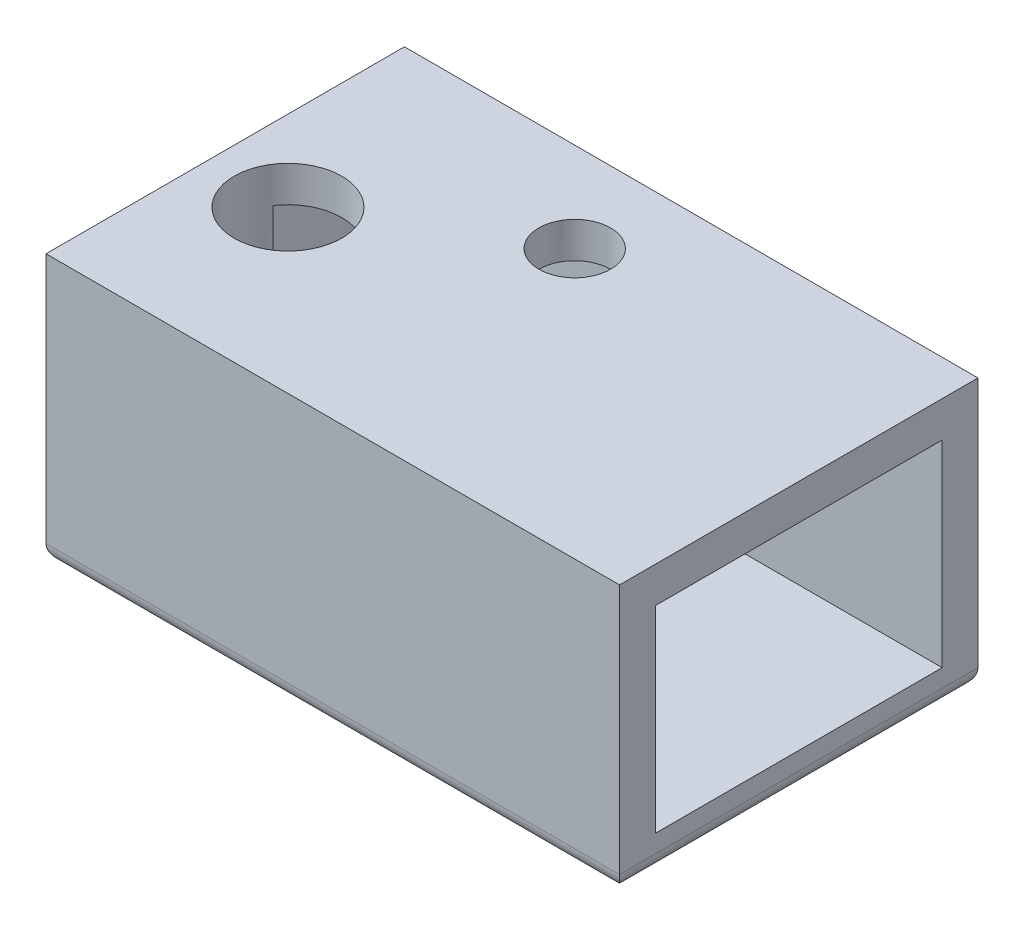
ISO-10303-21;
HEADER;
FILE_DESCRIPTION(('STEP AP214'),'2;1');
FILE_NAME('part.step','',(''),(''),'','','');
FILE_SCHEMA(('AUTOMOTIVE_DESIGN { 1 0 10303 214 1 1 1 1 }'));
ENDSEC;
DATA;
#1=APPLICATION_CONTEXT('core data for automotive mechanical design processes');
#2=APPLICATION_PROTOCOL_DEFINITION('international standard','automotive_design',2000,#1);
#3=PRODUCT_CONTEXT('',#1,'mechanical');
#4=PRODUCT('Part','Part','',(#3));
#5=PRODUCT_RELATED_PRODUCT_CATEGORY('part','',(#4));
#6=PRODUCT_DEFINITION_FORMATION('','',#4);
#7=PRODUCT_DEFINITION_CONTEXT('part definition',#1,'design');
#8=PRODUCT_DEFINITION('design','',#6,#7);
#9=PRODUCT_DEFINITION_SHAPE('','',#8);
#10=(LENGTH_UNIT() NAMED_UNIT(*) SI_UNIT(.MILLI.,.METRE.));
#11=(NAMED_UNIT(*) PLANE_ANGLE_UNIT() SI_UNIT($,.RADIAN.));
#12=(NAMED_UNIT(*) SI_UNIT($,.STERADIAN.) SOLID_ANGLE_UNIT());
#13=UNCERTAINTY_MEASURE_WITH_UNIT(LENGTH_MEASURE(1.E-05),#10,'distance_accuracy_value','');
#14=(GEOMETRIC_REPRESENTATION_CONTEXT(3) GLOBAL_UNCERTAINTY_ASSIGNED_CONTEXT((#13)) GLOBAL_UNIT_ASSIGNED_CONTEXT((#10,
#11,#12)) REPRESENTATION_CONTEXT('',''));
#15=CARTESIAN_POINT('',(0.,0.,0.));
#16=DIRECTION('',(0.,0.,1.));
#17=DIRECTION('',(1.,0.,0.));
#18=AXIS2_PLACEMENT_3D('',#15,#16,#17);
#19=CARTESIAN_POINT('',(-15.,11.,8.));
#20=DIRECTION('',(1.,0.,0.));
#21=DIRECTION('',(0.,0.,-1.));
#22=AXIS2_PLACEMENT_3D('',#19,#20,#21);
#23=PLANE('',#22);
#24=DIRECTION('',(0.,1.,0.));
#25=VECTOR('',#24,1.);
#26=CARTESIAN_POINT('',(-15.,-8.48528137423857,-0.658312395177701));
#27=LINE('',#26,#25);
#28=CARTESIAN_POINT('',(-15.,0.,-0.658312395177701));
#29=VERTEX_POINT('',#28);
#30=CARTESIAN_POINT('',(-15.,11.,-0.658312395177701));
#31=VERTEX_POINT('',#30);
#32=EDGE_CURVE('E129',#29,#31,#27,.T.);
#33=ORIENTED_EDGE('',*,*,#32,.F.);
#34=DIRECTION('',(0.,0.,1.));
#35=VECTOR('',#34,1.);
#36=CARTESIAN_POINT('',(-15.,0.,8.));
#37=LINE('',#36,#35);
#38=CARTESIAN_POINT('',(-15.,0.,-8.));
#39=VERTEX_POINT('',#38);
#40=EDGE_CURVE('E143',#39,#29,#37,.T.);
#41=ORIENTED_EDGE('',*,*,#40,.F.);
#42=DIRECTION('',(0.,-1.,0.));
#43=VECTOR('',#42,1.);
#44=CARTESIAN_POINT('',(-15.,11.,-8.));
#45=LINE('',#44,#43);
#46=CARTESIAN_POINT('',(-15.,11.,-8.));
#47=VERTEX_POINT('',#46);
#48=EDGE_CURVE('E167',#47,#39,#45,.T.);
#49=ORIENTED_EDGE('',*,*,#48,.F.);
#50=DIRECTION('',(0.,0.,1.));
#51=VECTOR('',#50,1.);
#52=CARTESIAN_POINT('',(-15.,11.,8.));
#53=LINE('',#52,#51);
#54=EDGE_CURVE('E145',#47,#31,#53,.T.);
#55=ORIENTED_EDGE('',*,*,#54,.T.);
#56=EDGE_LOOP('',(#33,#41,#49,#55));
#57=FACE_BOUND('',#56,.T.);
#58=ADVANCED_FACE('F35',(#57),#23,.T.);
#59=CARTESIAN_POINT('',(15.,11.,8.));
#60=DIRECTION('',(-1.,0.,0.));
#61=DIRECTION('',(0.,0.,1.));
#62=AXIS2_PLACEMENT_3D('',#59,#60,#61);
#63=PLANE('',#62);
#64=DIRECTION('',(0.,-1.,0.));
#65=VECTOR('',#64,1.);
#66=CARTESIAN_POINT('',(15.,11.,10.));
#67=LINE('',#66,#65);
#68=CARTESIAN_POINT('',(15.,13.,10.));
#69=VERTEX_POINT('',#68);
#70=CARTESIAN_POINT('',(15.,-1.,10.));
#71=VERTEX_POINT('',#70);
#72=EDGE_CURVE('E182',#69,#71,#67,.T.);
#73=ORIENTED_EDGE('',*,*,#72,.T.);
#74=DIRECTION('',(0.,0.,-1.));
#75=VECTOR('',#74,1.);
#76=CARTESIAN_POINT('',(15.,-1.,-10.));
#77=LINE('',#76,#75);
#78=CARTESIAN_POINT('',(15.,-1.,-10.));
#79=VERTEX_POINT('',#78);
#80=EDGE_CURVE('E44',#71,#79,#77,.T.);
#81=ORIENTED_EDGE('',*,*,#80,.T.);
#82=DIRECTION('',(0.,-1.,0.));
#83=VECTOR('',#82,1.);
#84=CARTESIAN_POINT('',(15.,11.,-10.));
#85=LINE('',#84,#83);
#86=CARTESIAN_POINT('',(15.,13.,-10.));
#87=VERTEX_POINT('',#86);
#88=EDGE_CURVE('E176',#87,#79,#85,.T.);
#89=ORIENTED_EDGE('',*,*,#88,.F.);
#90=DIRECTION('',(0.,0.,-1.));
#91=VECTOR('',#90,1.);
#92=CARTESIAN_POINT('',(15.,13.,0.));
#93=LINE('',#92,#91);
#94=EDGE_CURVE('E172',#69,#87,#93,.T.);
#95=ORIENTED_EDGE('',*,*,#94,.F.);
#96=EDGE_LOOP('',(#73,#81,#89,#95));
#97=FACE_BOUND('',#96,.T.);
#98=DIRECTION('',(0.,0.,-1.));
#99=VECTOR('',#98,1.);
#100=CARTESIAN_POINT('',(15.,0.,8.));
#101=LINE('',#100,#99);
#102=CARTESIAN_POINT('',(15.,0.,8.));
#103=VERTEX_POINT('',#102);
#104=CARTESIAN_POINT('',(15.,0.,-8.));
#105=VERTEX_POINT('',#104);
#106=EDGE_CURVE('E146',#103,#105,#101,.T.);
#107=ORIENTED_EDGE('',*,*,#106,.F.);
#108=DIRECTION('',(0.,-1.,0.));
#109=VECTOR('',#108,1.);
#110=CARTESIAN_POINT('',(15.,11.,8.));
#111=LINE('',#110,#109);
#112=CARTESIAN_POINT('',(15.,11.,8.));
#113=VERTEX_POINT('',#112);
#114=EDGE_CURVE('E160',#113,#103,#111,.T.);
#115=ORIENTED_EDGE('',*,*,#114,.F.);
#116=DIRECTION('',(0.,0.,-1.));
#117=VECTOR('',#116,1.);
#118=CARTESIAN_POINT('',(15.,11.,8.));
#119=LINE('',#118,#117);
#120=CARTESIAN_POINT('',(15.,11.,-8.));
#121=VERTEX_POINT('',#120);
#122=EDGE_CURVE('E155',#113,#121,#119,.T.);
#123=ORIENTED_EDGE('',*,*,#122,.T.);
#124=DIRECTION('',(0.,-1.,0.));
#125=VECTOR('',#124,1.);
#126=CARTESIAN_POINT('',(15.,11.,-8.));
#127=LINE('',#126,#125);
#128=EDGE_CURVE('E169',#121,#105,#127,.T.);
#129=ORIENTED_EDGE('',*,*,#128,.T.);
#130=EDGE_LOOP('',(#107,#115,#123,#129));
#131=FACE_BOUND('',#130,.T.);
#132=ADVANCED_FACE('F243',(#97,#131),#63,.F.);
#133=CARTESIAN_POINT('',(-15.,11.,-10.));
#134=DIRECTION('',(0.,0.,1.));
#135=DIRECTION('',(1.,0.,0.));
#136=AXIS2_PLACEMENT_3D('',#133,#134,#135);
#137=PLANE('',#136);
#138=ORIENTED_EDGE('',*,*,#88,.T.);
#139=DIRECTION('',(-1.,0.,0.));
#140=VECTOR('',#139,1.);
#141=CARTESIAN_POINT('',(-17.,-1.,-10.));
#142=LINE('',#141,#140);
#143=CARTESIAN_POINT('',(-17.,-1.,-10.));
#144=VERTEX_POINT('',#143);
#145=EDGE_CURVE('E202',#79,#144,#142,.T.);
#146=ORIENTED_EDGE('',*,*,#145,.T.);
#147=DIRECTION('',(0.,-1.,0.));
#148=VECTOR('',#147,1.);
#149=CARTESIAN_POINT('',(-17.,11.,-10.));
#150=LINE('',#149,#148);
#151=CARTESIAN_POINT('',(-17.,13.,-10.));
#152=VERTEX_POINT('',#151);
#153=EDGE_CURVE('E173',#152,#144,#150,.T.);
#154=ORIENTED_EDGE('',*,*,#153,.F.);
#155=DIRECTION('',(-1.,0.,0.));
#156=VECTOR('',#155,1.);
#157=CARTESIAN_POINT('',(0.,13.,-10.));
#158=LINE('',#157,#156);
#159=EDGE_CURVE('E178',#87,#152,#158,.T.);
#160=ORIENTED_EDGE('',*,*,#159,.F.);
#161=EDGE_LOOP('',(#138,#146,#154,#160));
#162=FACE_BOUND('',#161,.T.);
#163=ADVANCED_FACE('F269',(#162),#137,.F.);
#164=CARTESIAN_POINT('',(-17.,11.,8.));
#165=DIRECTION('',(1.,0.,0.));
#166=DIRECTION('',(0.,0.,-1.));
#167=AXIS2_PLACEMENT_3D('',#164,#165,#166);
#168=PLANE('',#167);
#169=ORIENTED_EDGE('',*,*,#153,.T.);
#170=DIRECTION('',(0.,0.,1.));
#171=VECTOR('',#170,1.);
#172=CARTESIAN_POINT('',(-17.,-1.,10.));
#173=LINE('',#172,#171);
#174=CARTESIAN_POINT('',(-17.,-1.,10.));
#175=VERTEX_POINT('',#174);
#176=EDGE_CURVE('E187',#144,#175,#173,.T.);
#177=ORIENTED_EDGE('',*,*,#176,.T.);
#178=DIRECTION('',(0.,-1.,0.));
#179=VECTOR('',#178,1.);
#180=CARTESIAN_POINT('',(-17.,11.,10.));
#181=LINE('',#180,#179);
#182=CARTESIAN_POINT('',(-17.,13.,10.));
#183=VERTEX_POINT('',#182);
#184=EDGE_CURVE('E177',#183,#175,#181,.T.);
#185=ORIENTED_EDGE('',*,*,#184,.F.);
#186=DIRECTION('',(0.,0.,1.));
#187=VECTOR('',#186,1.);
#188=CARTESIAN_POINT('',(-17.,13.,0.));
#189=LINE('',#188,#187);
#190=EDGE_CURVE('E180',#152,#183,#189,.T.);
#191=ORIENTED_EDGE('',*,*,#190,.F.);
#192=EDGE_LOOP('',(#169,#177,#185,#191));
#193=FACE_BOUND('',#192,.T.);
#194=ADVANCED_FACE('F277',(#193),#168,.F.);
#195=CARTESIAN_POINT('',(-15.,11.,10.));
#196=DIRECTION('',(0.,0.,-1.));
#197=DIRECTION('',(-1.,0.,0.));
#198=AXIS2_PLACEMENT_3D('',#195,#196,#197);
#199=PLANE('',#198);
#200=ORIENTED_EDGE('',*,*,#184,.T.);
#201=DIRECTION('',(1.,0.,0.));
#202=VECTOR('',#201,1.);
#203=CARTESIAN_POINT('',(15.,-1.,10.));
#204=LINE('',#203,#202);
#205=EDGE_CURVE('E11',#175,#71,#204,.T.);
#206=ORIENTED_EDGE('',*,*,#205,.T.);
#207=ORIENTED_EDGE('',*,*,#72,.F.);
#208=DIRECTION('',(1.,0.,0.));
#209=VECTOR('',#208,1.);
#210=CARTESIAN_POINT('',(0.,13.,10.));
#211=LINE('',#210,#209);
#212=EDGE_CURVE('E184',#183,#69,#211,.T.);
#213=ORIENTED_EDGE('',*,*,#212,.F.);
#214=EDGE_LOOP('',(#200,#206,#207,#213));
#215=FACE_BOUND('',#214,.T.);
#216=ADVANCED_FACE('F281',(#215),#199,.F.);
#217=CARTESIAN_POINT('',(0.,13.,0.));
#218=DIRECTION('',(0.,-1.,0.));
#219=DIRECTION('',(0.,0.,-1.));
#220=AXIS2_PLACEMENT_3D('',#217,#218,#219);
#221=PLANE('',#220);
#222=CARTESIAN_POINT('',(-12.5,13.,1.));
#223=DIRECTION('',(0.,1.,0.));
#224=DIRECTION('',(0.,0.,1.));
#225=AXIS2_PLACEMENT_3D('',#222,#223,#224);
#226=CIRCLE('',#225,3.);
#227=CARTESIAN_POINT('',(-12.5,13.,4.));
#228=VERTEX_POINT('',#227);
#229=EDGE_CURVE('E137',#228,#228,#226,.T.);
#230=ORIENTED_EDGE('',*,*,#229,.F.);
#231=EDGE_LOOP('',(#230));
#232=FACE_BOUND('',#231,.T.);
#233=CARTESIAN_POINT('',(-2.5,13.,-5.));
#234=DIRECTION('',(0.,1.,0.));
#235=DIRECTION('',(0.,0.,1.));
#236=AXIS2_PLACEMENT_3D('',#233,#234,#235);
#237=CIRCLE('',#236,2.);
#238=CARTESIAN_POINT('',(-2.5,13.,-3.));
#239=VERTEX_POINT('',#238);
#240=EDGE_CURVE('E214',#239,#239,#237,.T.);
#241=ORIENTED_EDGE('',*,*,#240,.F.);
#242=EDGE_LOOP('',(#241));
#243=FACE_BOUND('',#242,.T.);
#244=ORIENTED_EDGE('',*,*,#94,.T.);
#245=ORIENTED_EDGE('',*,*,#159,.T.);
#246=ORIENTED_EDGE('',*,*,#190,.T.);
#247=ORIENTED_EDGE('',*,*,#212,.T.);
#248=EDGE_LOOP('',(#244,#245,#246,#247));
#249=FACE_BOUND('',#248,.T.);
#250=ADVANCED_FACE('F285',(#232,#243,#249),#221,.F.);
#251=CARTESIAN_POINT('',(0.,-2.,0.));
#252=DIRECTION('',(0.,-1.,0.));
#253=DIRECTION('',(0.,0.,-1.));
#254=AXIS2_PLACEMENT_3D('',#251,#252,#253);
#255=PLANE('',#254);
#256=DIRECTION('',(1.,0.,0.));
#257=VECTOR('',#256,1.);
#258=CARTESIAN_POINT('',(-17.,-2.,9.));
#259=LINE('',#258,#257);
#260=CARTESIAN_POINT('',(14.,-2.,9.));
#261=VERTEX_POINT('',#260);
#262=CARTESIAN_POINT('',(-16.,-2.,9.));
#263=VERTEX_POINT('',#262);
#264=EDGE_CURVE('E193',#261,#263,#259,.F.);
#265=ORIENTED_EDGE('',*,*,#264,.T.);
#266=DIRECTION('',(0.,0.,1.));
#267=VECTOR('',#266,1.);
#268=CARTESIAN_POINT('',(-16.,-2.,-10.));
#269=LINE('',#268,#267);
#270=CARTESIAN_POINT('',(-16.,-2.,-9.));
#271=VERTEX_POINT('',#270);
#272=EDGE_CURVE('E199',#263,#271,#269,.F.);
#273=ORIENTED_EDGE('',*,*,#272,.T.);
#274=DIRECTION('',(-1.,0.,0.));
#275=VECTOR('',#274,1.);
#276=CARTESIAN_POINT('',(15.,-2.,-9.));
#277=LINE('',#276,#275);
#278=CARTESIAN_POINT('',(14.,-2.,-9.));
#279=VERTEX_POINT('',#278);
#280=EDGE_CURVE('E197',#271,#279,#277,.F.);
#281=ORIENTED_EDGE('',*,*,#280,.T.);
#282=DIRECTION('',(0.,0.,-1.));
#283=VECTOR('',#282,1.);
#284=CARTESIAN_POINT('',(14.,-2.,10.));
#285=LINE('',#284,#283);
#286=EDGE_CURVE('E195',#279,#261,#285,.F.);
#287=ORIENTED_EDGE('',*,*,#286,.T.);
#288=EDGE_LOOP('',(#265,#273,#281,#287));
#289=FACE_BOUND('',#288,.T.);
#290=ADVANCED_FACE('F273',(#289),#255,.T.);
#291=CARTESIAN_POINT('',(-15.,11.,-8.));
#292=DIRECTION('',(0.,0.,1.));
#293=DIRECTION('',(1.,0.,0.));
#294=AXIS2_PLACEMENT_3D('',#291,#292,#293);
#295=PLANE('',#294);
#296=DIRECTION('',(-1.,0.,0.));
#297=VECTOR('',#296,1.);
#298=CARTESIAN_POINT('',(-15.,0.,-8.));
#299=LINE('',#298,#297);
#300=EDGE_CURVE('E150',#105,#39,#299,.T.);
#301=ORIENTED_EDGE('',*,*,#300,.F.);
#302=ORIENTED_EDGE('',*,*,#128,.F.);
#303=DIRECTION('',(-1.,0.,0.));
#304=VECTOR('',#303,1.);
#305=CARTESIAN_POINT('',(-15.,11.,-8.));
#306=LINE('',#305,#304);
#307=EDGE_CURVE('E233',#121,#47,#306,.T.);
#308=ORIENTED_EDGE('',*,*,#307,.T.);
#309=ORIENTED_EDGE('',*,*,#48,.T.);
#310=EDGE_LOOP('',(#301,#302,#308,#309));
#311=FACE_BOUND('',#310,.T.);
#312=ADVANCED_FACE('F245',(#311),#295,.T.);
#313=DIRECTION('',(0.,1.,0.));
#314=VECTOR('',#313,1.);
#315=CARTESIAN_POINT('',(-15.,-8.48528137423857,2.6583123951777));
#316=LINE('',#315,#314);
#317=CARTESIAN_POINT('',(-15.,11.,2.6583123951777));
#318=VERTEX_POINT('',#317);
#319=CARTESIAN_POINT('',(-15.,0.,2.6583123951777));
#320=VERTEX_POINT('',#319);
#321=EDGE_CURVE('E132',#318,#320,#316,.F.);
#322=ORIENTED_EDGE('',*,*,#321,.F.);
#323=CARTESIAN_POINT('',(-15.,11.,8.));
#324=VERTEX_POINT('',#323);
#325=EDGE_CURVE('E235',#318,#324,#53,.T.);
#326=ORIENTED_EDGE('',*,*,#325,.T.);
#327=DIRECTION('',(0.,-1.,0.));
#328=VECTOR('',#327,1.);
#329=CARTESIAN_POINT('',(-15.,11.,8.));
#330=LINE('',#329,#328);
#331=CARTESIAN_POINT('',(-15.,0.,8.));
#332=VERTEX_POINT('',#331);
#333=EDGE_CURVE('E163',#324,#332,#330,.T.);
#334=ORIENTED_EDGE('',*,*,#333,.T.);
#335=EDGE_CURVE('E153',#320,#332,#37,.T.);
#336=ORIENTED_EDGE('',*,*,#335,.F.);
#337=EDGE_LOOP('',(#322,#326,#334,#336));
#338=FACE_BOUND('',#337,.T.);
#339=ADVANCED_FACE('F252',(#338),#23,.T.);
#340=CARTESIAN_POINT('',(-15.,11.,8.));
#341=DIRECTION('',(0.,0.,-1.));
#342=DIRECTION('',(-1.,0.,0.));
#343=AXIS2_PLACEMENT_3D('',#340,#341,#342);
#344=PLANE('',#343);
#345=DIRECTION('',(1.,0.,0.));
#346=VECTOR('',#345,1.);
#347=CARTESIAN_POINT('',(-15.,0.,8.));
#348=LINE('',#347,#346);
#349=EDGE_CURVE('E152',#332,#103,#348,.T.);
#350=ORIENTED_EDGE('',*,*,#349,.F.);
#351=ORIENTED_EDGE('',*,*,#333,.F.);
#352=DIRECTION('',(1.,0.,0.));
#353=VECTOR('',#352,1.);
#354=CARTESIAN_POINT('',(-15.,11.,8.));
#355=LINE('',#354,#353);
#356=EDGE_CURVE('E164',#324,#113,#355,.T.);
#357=ORIENTED_EDGE('',*,*,#356,.T.);
#358=ORIENTED_EDGE('',*,*,#114,.T.);
#359=EDGE_LOOP('',(#350,#351,#357,#358));
#360=FACE_BOUND('',#359,.T.);
#361=ADVANCED_FACE('F255',(#360),#344,.T.);
#362=CARTESIAN_POINT('',(0.,11.,0.));
#363=DIRECTION('',(0.,-1.,0.));
#364=DIRECTION('',(0.,0.,-1.));
#365=AXIS2_PLACEMENT_3D('',#362,#363,#364);
#366=PLANE('',#365);
#367=CARTESIAN_POINT('',(-12.5,11.,1.));
#368=DIRECTION('',(0.,-1.,0.));
#369=DIRECTION('',(0.,0.,-1.));
#370=AXIS2_PLACEMENT_3D('',#367,#368,#369);
#371=CIRCLE('',#370,3.);
#372=EDGE_CURVE('E228',#31,#318,#371,.T.);
#373=ORIENTED_EDGE('',*,*,#372,.F.);
#374=ORIENTED_EDGE('',*,*,#54,.F.);
#375=ORIENTED_EDGE('',*,*,#307,.F.);
#376=ORIENTED_EDGE('',*,*,#122,.F.);
#377=ORIENTED_EDGE('',*,*,#356,.F.);
#378=ORIENTED_EDGE('',*,*,#325,.F.);
#379=EDGE_LOOP('',(#373,#374,#375,#376,#377,#378));
#380=FACE_BOUND('',#379,.T.);
#381=CARTESIAN_POINT('',(-2.5,11.,-5.));
#382=DIRECTION('',(0.,-1.,0.));
#383=DIRECTION('',(0.,0.,-1.));
#384=AXIS2_PLACEMENT_3D('',#381,#382,#383);
#385=CIRCLE('',#384,2.);
#386=CARTESIAN_POINT('',(-2.5,11.,-7.));
#387=VERTEX_POINT('',#386);
#388=EDGE_CURVE('E136',#387,#387,#385,.T.);
#389=ORIENTED_EDGE('',*,*,#388,.F.);
#390=EDGE_LOOP('',(#389));
#391=FACE_BOUND('',#390,.T.);
#392=ADVANCED_FACE('F247',(#380,#391),#366,.T.);
#393=CARTESIAN_POINT('',(0.,0.,0.));
#394=DIRECTION('',(0.,-1.,0.));
#395=DIRECTION('',(0.,0.,-1.));
#396=AXIS2_PLACEMENT_3D('',#393,#394,#395);
#397=PLANE('',#396);
#398=ORIENTED_EDGE('',*,*,#40,.T.);
#399=CARTESIAN_POINT('',(-12.5,0.,1.));
#400=DIRECTION('',(0.,-1.,0.));
#401=DIRECTION('',(0.,0.,-1.));
#402=AXIS2_PLACEMENT_3D('',#399,#400,#401);
#403=CIRCLE('',#402,3.);
#404=EDGE_CURVE('E125',#29,#320,#403,.F.);
#405=ORIENTED_EDGE('',*,*,#404,.T.);
#406=ORIENTED_EDGE('',*,*,#335,.T.);
#407=ORIENTED_EDGE('',*,*,#349,.T.);
#408=ORIENTED_EDGE('',*,*,#106,.T.);
#409=ORIENTED_EDGE('',*,*,#300,.T.);
#410=EDGE_LOOP('',(#398,#405,#406,#407,#408,#409));
#411=FACE_BOUND('',#410,.T.);
#412=ADVANCED_FACE('F148',(#411),#397,.F.);
#413=CARTESIAN_POINT('',(-2.5,-8.48528137423857,-5.));
#414=DIRECTION('',(0.,1.,0.));
#415=DIRECTION('',(0.,0.,1.));
#416=AXIS2_PLACEMENT_3D('',#413,#414,#415);
#417=CYLINDRICAL_SURFACE('',#416,2.);
#418=ORIENTED_EDGE('',*,*,#388,.T.);
#419=EDGE_LOOP('',(#418));
#420=FACE_BOUND('',#419,.T.);
#421=ORIENTED_EDGE('',*,*,#240,.T.);
#422=EDGE_LOOP('',(#421));
#423=FACE_BOUND('',#422,.T.);
#424=ADVANCED_FACE('F307',(#420,#423),#417,.F.);
#425=CARTESIAN_POINT('',(-12.5,-8.48528137423857,1.));
#426=DIRECTION('',(0.,1.,0.));
#427=DIRECTION('',(0.,0.,1.));
#428=AXIS2_PLACEMENT_3D('',#425,#426,#427);
#429=CYLINDRICAL_SURFACE('',#428,3.);
#430=ORIENTED_EDGE('',*,*,#32,.T.);
#431=ORIENTED_EDGE('',*,*,#372,.T.);
#432=ORIENTED_EDGE('',*,*,#321,.T.);
#433=ORIENTED_EDGE('',*,*,#404,.F.);
#434=EDGE_LOOP('',(#430,#431,#432,#433));
#435=FACE_BOUND('',#434,.T.);
#436=ORIENTED_EDGE('',*,*,#229,.T.);
#437=EDGE_LOOP('',(#436));
#438=FACE_BOUND('',#437,.T.);
#439=ADVANCED_FACE('F127',(#435,#438),#429,.F.);
#440=CARTESIAN_POINT('',(14.,-1.,8.));
#441=DIRECTION('',(0.,0.,1.));
#442=DIRECTION('',(1.,0.,0.));
#443=AXIS2_PLACEMENT_3D('',#440,#441,#442);
#444=CYLINDRICAL_SURFACE('',#443,1.);
#445=CARTESIAN_POINT('',(14.,-1.,9.));
#446=DIRECTION('',(-0.707106781186547,0.,0.707106781186547));
#447=DIRECTION('',(-0.707106781186547,0.,-0.707106781186547));
#448=AXIS2_PLACEMENT_3D('',#445,#446,#447);
#449=ELLIPSE('',#448,1.41421356237309,1.);
#450=EDGE_CURVE('E208',#261,#71,#449,.T.);
#451=ORIENTED_EDGE('',*,*,#450,.F.);
#452=ORIENTED_EDGE('',*,*,#286,.F.);
#453=CARTESIAN_POINT('',(14.,-1.,-9.));
#454=DIRECTION('',(0.707106781186547,0.,0.707106781186547));
#455=DIRECTION('',(-0.707106781186547,0.,0.707106781186547));
#456=AXIS2_PLACEMENT_3D('',#453,#454,#455);
#457=ELLIPSE('',#456,1.41421356237309,1.);
#458=EDGE_CURVE('E39',#79,#279,#457,.F.);
#459=ORIENTED_EDGE('',*,*,#458,.F.);
#460=ORIENTED_EDGE('',*,*,#80,.F.);
#461=EDGE_LOOP('',(#451,#452,#459,#460));
#462=FACE_BOUND('',#461,.T.);
#463=ADVANCED_FACE('F37',(#462),#444,.T.);
#464=CARTESIAN_POINT('',(-15.,-1.,-9.));
#465=DIRECTION('',(1.,0.,0.));
#466=DIRECTION('',(0.,0.,-1.));
#467=AXIS2_PLACEMENT_3D('',#464,#465,#466);
#468=CYLINDRICAL_SURFACE('',#467,1.);
#469=ORIENTED_EDGE('',*,*,#458,.T.);
#470=ORIENTED_EDGE('',*,*,#280,.F.);
#471=CARTESIAN_POINT('',(-16.,-1.,-9.));
#472=DIRECTION('',(0.707106781186547,0.,-0.707106781186547));
#473=DIRECTION('',(0.707106781186547,0.,0.707106781186547));
#474=AXIS2_PLACEMENT_3D('',#471,#472,#473);
#475=ELLIPSE('',#474,1.41421356237309,1.);
#476=EDGE_CURVE('E207',#144,#271,#475,.F.);
#477=ORIENTED_EDGE('',*,*,#476,.F.);
#478=ORIENTED_EDGE('',*,*,#145,.F.);
#479=EDGE_LOOP('',(#469,#470,#477,#478));
#480=FACE_BOUND('',#479,.T.);
#481=ADVANCED_FACE('F298',(#480),#468,.T.);
#482=CARTESIAN_POINT('',(-15.,-1.,9.));
#483=DIRECTION('',(-1.,0.,0.));
#484=DIRECTION('',(0.,0.,1.));
#485=AXIS2_PLACEMENT_3D('',#482,#483,#484);
#486=CYLINDRICAL_SURFACE('',#485,1.);
#487=ORIENTED_EDGE('',*,*,#450,.T.);
#488=ORIENTED_EDGE('',*,*,#205,.F.);
#489=CARTESIAN_POINT('',(-16.,-1.,9.));
#490=DIRECTION('',(-0.707106781186547,0.,-0.707106781186547));
#491=DIRECTION('',(-0.707106781186547,0.,0.707106781186547));
#492=AXIS2_PLACEMENT_3D('',#489,#490,#491);
#493=ELLIPSE('',#492,1.41421356237309,1.);
#494=EDGE_CURVE('E205',#263,#175,#493,.T.);
#495=ORIENTED_EDGE('',*,*,#494,.F.);
#496=ORIENTED_EDGE('',*,*,#264,.F.);
#497=EDGE_LOOP('',(#487,#488,#495,#496));
#498=FACE_BOUND('',#497,.T.);
#499=ADVANCED_FACE('F295',(#498),#486,.T.);
#500=CARTESIAN_POINT('',(-16.,-1.,8.));
#501=DIRECTION('',(0.,0.,-1.));
#502=DIRECTION('',(-1.,0.,0.));
#503=AXIS2_PLACEMENT_3D('',#500,#501,#502);
#504=CYLINDRICAL_SURFACE('',#503,1.);
#505=ORIENTED_EDGE('',*,*,#476,.T.);
#506=ORIENTED_EDGE('',*,*,#272,.F.);
#507=ORIENTED_EDGE('',*,*,#494,.T.);
#508=ORIENTED_EDGE('',*,*,#176,.F.);
#509=EDGE_LOOP('',(#505,#506,#507,#508));
#510=FACE_BOUND('',#509,.T.);
#511=ADVANCED_FACE('F292',(#510),#504,.T.);
#512=CLOSED_SHELL('',(#58,#132,#163,#194,#216,#250,#290,#312,#339,#361,#392,#412,#424,#439,#463,
#481,#499,#511));
#513=MANIFOLD_SOLID_BREP('B2',#512);
#514=ADVANCED_BREP_SHAPE_REPRESENTATION('',(#18,#513),#14);
#515=SHAPE_DEFINITION_REPRESENTATION(#9,#514);
ENDSEC;
END-ISO-10303-21;
